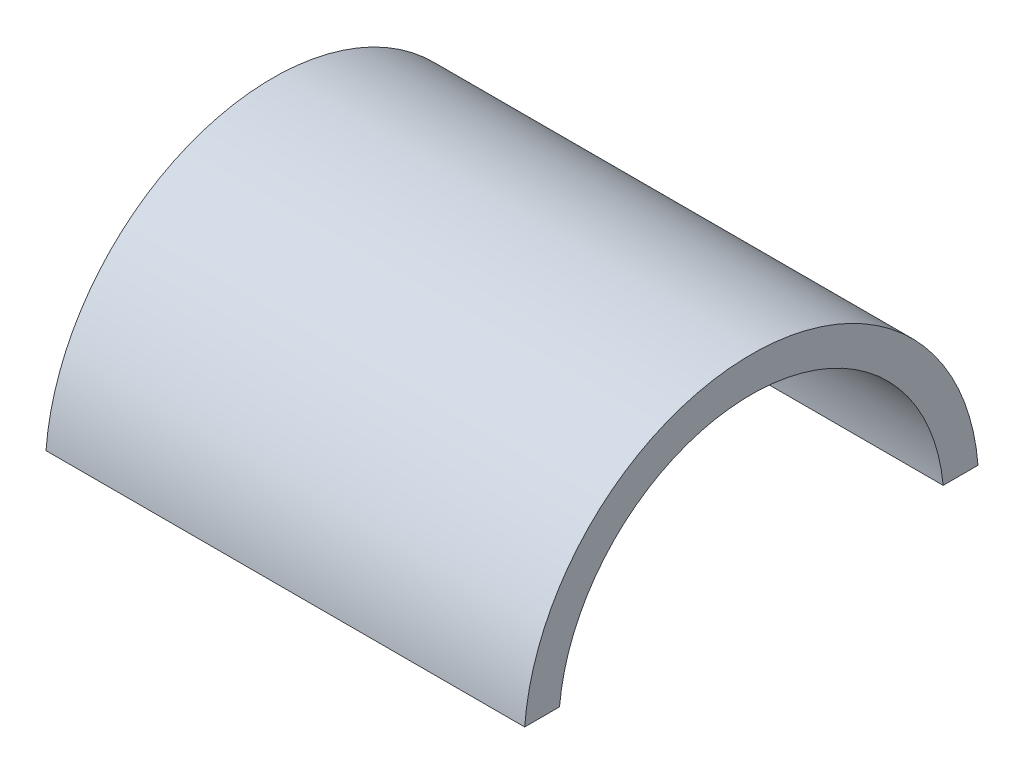
ISO-10303-21;
HEADER;
FILE_DESCRIPTION(('STEP AP214'),'2;1');
FILE_NAME('part.step','',(''),(''),'','','');
FILE_SCHEMA(('AUTOMOTIVE_DESIGN { 1 0 10303 214 1 1 1 1 }'));
ENDSEC;
DATA;
#1=APPLICATION_CONTEXT('core data for automotive mechanical design processes');
#2=APPLICATION_PROTOCOL_DEFINITION('international standard','automotive_design',2000,#1);
#3=PRODUCT_CONTEXT('',#1,'mechanical');
#4=PRODUCT('Part','Part','',(#3));
#5=PRODUCT_RELATED_PRODUCT_CATEGORY('part','',(#4));
#6=PRODUCT_DEFINITION_FORMATION('','',#4);
#7=PRODUCT_DEFINITION_CONTEXT('part definition',#1,'design');
#8=PRODUCT_DEFINITION('design','',#6,#7);
#9=PRODUCT_DEFINITION_SHAPE('','',#8);
#10=(LENGTH_UNIT() NAMED_UNIT(*) SI_UNIT(.MILLI.,.METRE.));
#11=(NAMED_UNIT(*) PLANE_ANGLE_UNIT() SI_UNIT($,.RADIAN.));
#12=(NAMED_UNIT(*) SI_UNIT($,.STERADIAN.) SOLID_ANGLE_UNIT());
#13=UNCERTAINTY_MEASURE_WITH_UNIT(LENGTH_MEASURE(1.E-05),#10,'distance_accuracy_value','');
#14=(GEOMETRIC_REPRESENTATION_CONTEXT(3) GLOBAL_UNCERTAINTY_ASSIGNED_CONTEXT((#13)) GLOBAL_UNIT_ASSIGNED_CONTEXT((#10,
#11,#12)) REPRESENTATION_CONTEXT('',''));
#15=CARTESIAN_POINT('',(0.,0.,0.));
#16=DIRECTION('',(0.,0.,1.));
#17=DIRECTION('',(1.,0.,0.));
#18=AXIS2_PLACEMENT_3D('',#15,#16,#17);
#19=CARTESIAN_POINT('',(25.4,0.,0.));
#20=DIRECTION('',(-1.,0.,0.));
#21=DIRECTION('',(0.,0.,1.));
#22=AXIS2_PLACEMENT_3D('',#19,#20,#21);
#23=CYLINDRICAL_SURFACE('',#22,24.13);
#24=CARTESIAN_POINT('',(-25.4,0.,0.));
#25=DIRECTION('',(1.,0.,0.));
#26=DIRECTION('',(0.,0.,-1.));
#27=AXIS2_PLACEMENT_3D('',#24,#25,#26);
#28=CIRCLE('',#27,24.13);
#29=CARTESIAN_POINT('',(-25.4,1.905,-24.0546850945923));
#30=VERTEX_POINT('',#29);
#31=CARTESIAN_POINT('',(-25.4,1.905,24.0546850945923));
#32=VERTEX_POINT('',#31);
#33=EDGE_CURVE('E98',#30,#32,#28,.T.);
#34=ORIENTED_EDGE('',*,*,#33,.T.);
#35=DIRECTION('',(-1.,0.,0.));
#36=VECTOR('',#35,1.);
#37=CARTESIAN_POINT('',(25.4,1.905,24.0546850945923));
#38=LINE('',#37,#36);
#39=CARTESIAN_POINT('',(25.4,1.905,24.0546850945923));
#40=VERTEX_POINT('',#39);
#41=EDGE_CURVE('E11',#40,#32,#38,.T.);
#42=ORIENTED_EDGE('',*,*,#41,.F.);
#43=CARTESIAN_POINT('',(25.4,0.,0.));
#44=DIRECTION('',(1.,0.,0.));
#45=DIRECTION('',(0.,0.,-1.));
#46=AXIS2_PLACEMENT_3D('',#43,#44,#45);
#47=CIRCLE('',#46,24.13);
#48=CARTESIAN_POINT('',(25.4,1.905,-24.0546850945923));
#49=VERTEX_POINT('',#48);
#50=EDGE_CURVE('E86',#49,#40,#47,.T.);
#51=ORIENTED_EDGE('',*,*,#50,.F.);
#52=DIRECTION('',(-1.,0.,0.));
#53=VECTOR('',#52,1.);
#54=CARTESIAN_POINT('',(25.4,1.905,-24.0546850945923));
#55=LINE('',#54,#53);
#56=EDGE_CURVE('E94',#49,#30,#55,.T.);
#57=ORIENTED_EDGE('',*,*,#56,.T.);
#58=EDGE_LOOP('',(#34,#42,#51,#57));
#59=FACE_BOUND('',#58,.T.);
#60=ADVANCED_FACE('F35',(#59),#23,.T.);
#61=CARTESIAN_POINT('',(25.4,1.905,24.0546850945923));
#62=DIRECTION('',(0.,1.,0.));
#63=DIRECTION('',(0.,0.,1.));
#64=AXIS2_PLACEMENT_3D('',#61,#62,#63);
#65=PLANE('',#64);
#66=DIRECTION('',(0.,0.,-1.));
#67=VECTOR('',#66,1.);
#68=CARTESIAN_POINT('',(-25.4,1.905,24.0546850945923));
#69=LINE('',#68,#67);
#70=CARTESIAN_POINT('',(-25.4,1.905,20.3580643480661));
#71=VERTEX_POINT('',#70);
#72=EDGE_CURVE('E90',#32,#71,#69,.T.);
#73=ORIENTED_EDGE('',*,*,#72,.T.);
#74=DIRECTION('',(-1.,0.,0.));
#75=VECTOR('',#74,1.);
#76=CARTESIAN_POINT('',(25.4,1.905,20.3580643480661));
#77=LINE('',#76,#75);
#78=CARTESIAN_POINT('',(25.4,1.905,20.3580643480661));
#79=VERTEX_POINT('',#78);
#80=EDGE_CURVE('E43',#79,#71,#77,.T.);
#81=ORIENTED_EDGE('',*,*,#80,.F.);
#82=DIRECTION('',(0.,0.,-1.));
#83=VECTOR('',#82,1.);
#84=CARTESIAN_POINT('',(25.4,1.905,24.0546850945923));
#85=LINE('',#84,#83);
#86=EDGE_CURVE('E81',#40,#79,#85,.T.);
#87=ORIENTED_EDGE('',*,*,#86,.F.);
#88=ORIENTED_EDGE('',*,*,#41,.T.);
#89=EDGE_LOOP('',(#73,#81,#87,#88));
#90=FACE_BOUND('',#89,.T.);
#91=ADVANCED_FACE('F89',(#90),#65,.F.);
#92=CARTESIAN_POINT('',(25.4,0.,0.));
#93=DIRECTION('',(-1.,0.,0.));
#94=DIRECTION('',(0.,0.,1.));
#95=AXIS2_PLACEMENT_3D('',#92,#93,#94);
#96=CYLINDRICAL_SURFACE('',#95,20.447);
#97=CARTESIAN_POINT('',(-25.4,0.,0.));
#98=DIRECTION('',(-1.,0.,0.));
#99=DIRECTION('',(0.,0.,-1.));
#100=AXIS2_PLACEMENT_3D('',#97,#98,#99);
#101=CIRCLE('',#100,20.447);
#102=CARTESIAN_POINT('',(-25.4,1.905,-20.3580643480661));
#103=VERTEX_POINT('',#102);
#104=EDGE_CURVE('E68',#71,#103,#101,.T.);
#105=ORIENTED_EDGE('',*,*,#104,.T.);
#106=DIRECTION('',(-1.,0.,0.));
#107=VECTOR('',#106,1.);
#108=CARTESIAN_POINT('',(25.4,1.905,-20.3580643480661));
#109=LINE('',#108,#107);
#110=CARTESIAN_POINT('',(25.4,1.905,-20.3580643480661));
#111=VERTEX_POINT('',#110);
#112=EDGE_CURVE('E91',#111,#103,#109,.T.);
#113=ORIENTED_EDGE('',*,*,#112,.F.);
#114=CARTESIAN_POINT('',(25.4,0.,0.));
#115=DIRECTION('',(-1.,0.,0.));
#116=DIRECTION('',(0.,0.,-1.));
#117=AXIS2_PLACEMENT_3D('',#114,#115,#116);
#118=CIRCLE('',#117,20.447);
#119=EDGE_CURVE('E84',#79,#111,#118,.T.);
#120=ORIENTED_EDGE('',*,*,#119,.F.);
#121=ORIENTED_EDGE('',*,*,#80,.T.);
#122=EDGE_LOOP('',(#105,#113,#120,#121));
#123=FACE_BOUND('',#122,.T.);
#124=ADVANCED_FACE('F92',(#123),#96,.F.);
#125=CARTESIAN_POINT('',(25.4,1.905,-20.3580643480661));
#126=DIRECTION('',(0.,1.,0.));
#127=DIRECTION('',(0.,0.,1.));
#128=AXIS2_PLACEMENT_3D('',#125,#126,#127);
#129=PLANE('',#128);
#130=DIRECTION('',(0.,0.,-1.));
#131=VECTOR('',#130,1.);
#132=CARTESIAN_POINT('',(-25.4,1.905,-20.3580643480661));
#133=LINE('',#132,#131);
#134=EDGE_CURVE('E74',#103,#30,#133,.T.);
#135=ORIENTED_EDGE('',*,*,#134,.T.);
#136=ORIENTED_EDGE('',*,*,#56,.F.);
#137=DIRECTION('',(0.,0.,-1.));
#138=VECTOR('',#137,1.);
#139=CARTESIAN_POINT('',(25.4,1.905,-20.3580643480661));
#140=LINE('',#139,#138);
#141=EDGE_CURVE('E51',#111,#49,#140,.T.);
#142=ORIENTED_EDGE('',*,*,#141,.F.);
#143=ORIENTED_EDGE('',*,*,#112,.T.);
#144=EDGE_LOOP('',(#135,#136,#142,#143));
#145=FACE_BOUND('',#144,.T.);
#146=ADVANCED_FACE('F105',(#145),#129,.F.);
#147=CARTESIAN_POINT('',(25.4,0.,0.));
#148=DIRECTION('',(1.,0.,0.));
#149=DIRECTION('',(0.,0.,-1.));
#150=AXIS2_PLACEMENT_3D('',#147,#148,#149);
#151=PLANE('',#150);
#152=ORIENTED_EDGE('',*,*,#50,.T.);
#153=ORIENTED_EDGE('',*,*,#86,.T.);
#154=ORIENTED_EDGE('',*,*,#119,.T.);
#155=ORIENTED_EDGE('',*,*,#141,.T.);
#156=EDGE_LOOP('',(#152,#153,#154,#155));
#157=FACE_BOUND('',#156,.T.);
#158=ADVANCED_FACE('F82',(#157),#151,.T.);
#159=CARTESIAN_POINT('',(-25.4,0.,0.));
#160=DIRECTION('',(1.,0.,0.));
#161=DIRECTION('',(0.,0.,-1.));
#162=AXIS2_PLACEMENT_3D('',#159,#160,#161);
#163=PLANE('',#162);
#164=ORIENTED_EDGE('',*,*,#33,.F.);
#165=ORIENTED_EDGE('',*,*,#134,.F.);
#166=ORIENTED_EDGE('',*,*,#104,.F.);
#167=ORIENTED_EDGE('',*,*,#72,.F.);
#168=EDGE_LOOP('',(#164,#165,#166,#167));
#169=FACE_BOUND('',#168,.T.);
#170=ADVANCED_FACE('F108',(#169),#163,.F.);
#171=CLOSED_SHELL('',(#60,#91,#124,#146,#158,#170));
#172=MANIFOLD_SOLID_BREP('B2',#171);
#173=ADVANCED_BREP_SHAPE_REPRESENTATION('',(#18,#172),#14);
#174=SHAPE_DEFINITION_REPRESENTATION(#9,#173);
ENDSEC;
END-ISO-10303-21;
